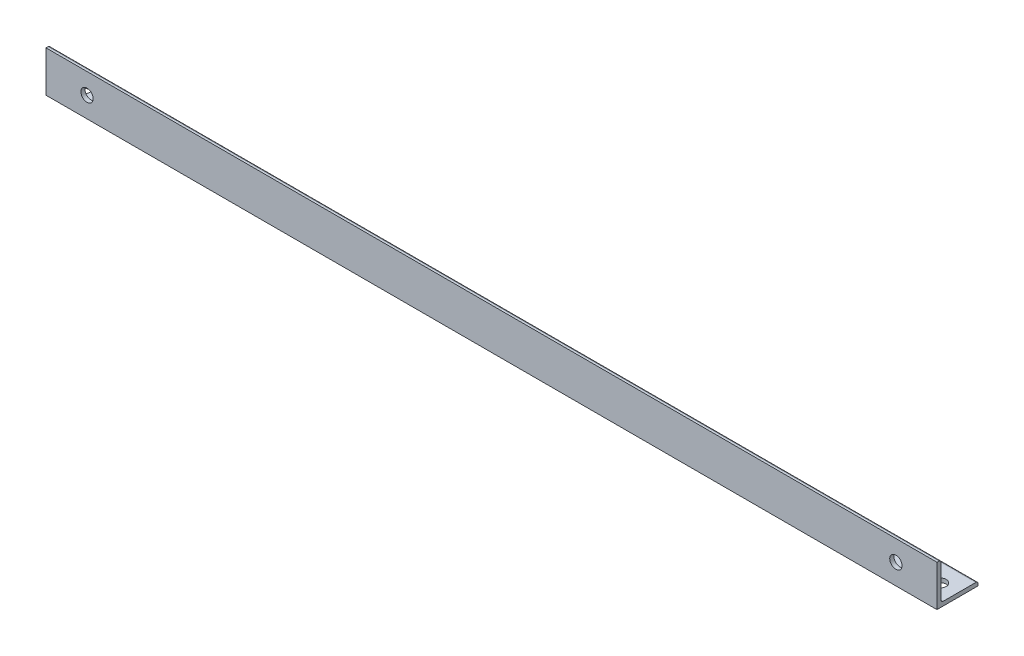
ISO-10303-21;
HEADER;
FILE_DESCRIPTION(('STEP AP214'),'2;1');
FILE_NAME('part.step','',(''),(''),'','','');
FILE_SCHEMA(('AUTOMOTIVE_DESIGN { 1 0 10303 214 1 1 1 1 }'));
ENDSEC;
DATA;
#1=APPLICATION_CONTEXT('core data for automotive mechanical design processes');
#2=APPLICATION_PROTOCOL_DEFINITION('international standard','automotive_design',2000,#1);
#3=PRODUCT_CONTEXT('',#1,'mechanical');
#4=PRODUCT('Part','Part','',(#3));
#5=PRODUCT_RELATED_PRODUCT_CATEGORY('part','',(#4));
#6=PRODUCT_DEFINITION_FORMATION('','',#4);
#7=PRODUCT_DEFINITION_CONTEXT('part definition',#1,'design');
#8=PRODUCT_DEFINITION('design','',#6,#7);
#9=PRODUCT_DEFINITION_SHAPE('','',#8);
#10=(LENGTH_UNIT() NAMED_UNIT(*) SI_UNIT(.MILLI.,.METRE.));
#11=(NAMED_UNIT(*) PLANE_ANGLE_UNIT() SI_UNIT($,.RADIAN.));
#12=(NAMED_UNIT(*) SI_UNIT($,.STERADIAN.) SOLID_ANGLE_UNIT());
#13=UNCERTAINTY_MEASURE_WITH_UNIT(LENGTH_MEASURE(1.E-05),#10,'distance_accuracy_value','');
#14=(GEOMETRIC_REPRESENTATION_CONTEXT(3) GLOBAL_UNCERTAINTY_ASSIGNED_CONTEXT((#13)) GLOBAL_UNIT_ASSIGNED_CONTEXT((#10,
#11,#12)) REPRESENTATION_CONTEXT('',''));
#15=CARTESIAN_POINT('',(0.,0.,0.));
#16=DIRECTION('',(0.,0.,1.));
#17=DIRECTION('',(1.,0.,0.));
#18=AXIS2_PLACEMENT_3D('',#15,#16,#17);
#19=CARTESIAN_POINT('',(434.,0.,0.));
#20=DIRECTION('',(0.,1.,0.));
#21=DIRECTION('',(0.,0.,1.));
#22=AXIS2_PLACEMENT_3D('',#19,#20,#21);
#23=PLANE('',#22);
#24=CARTESIAN_POINT('',(184.5,0.,-10.));
#25=DIRECTION('',(0.,1.,0.));
#26=DIRECTION('',(0.,0.,1.));
#27=AXIS2_PLACEMENT_3D('',#24,#25,#26);
#28=CIRCLE('',#27,2.99999999999999);
#29=CARTESIAN_POINT('',(184.5,0.,-7.00000000000001));
#30=VERTEX_POINT('',#29);
#31=EDGE_CURVE('E228',#30,#30,#28,.T.);
#32=ORIENTED_EDGE('',*,*,#31,.T.);
#33=EDGE_LOOP('',(#32));
#34=FACE_BOUND('',#33,.T.);
#35=CARTESIAN_POINT('',(8.5,0.,-10.));
#36=DIRECTION('',(0.,-1.,0.));
#37=DIRECTION('',(0.,0.,-1.));
#38=AXIS2_PLACEMENT_3D('',#35,#36,#37);
#39=CIRCLE('',#38,3.);
#40=CARTESIAN_POINT('',(8.5,0.,-13.));
#41=VERTEX_POINT('',#40);
#42=EDGE_CURVE('E177',#41,#41,#39,.T.);
#43=ORIENTED_EDGE('',*,*,#42,.F.);
#44=EDGE_LOOP('',(#43));
#45=FACE_BOUND('',#44,.T.);
#46=CARTESIAN_POINT('',(425.5,0.,-10.));
#47=DIRECTION('',(0.,-1.,0.));
#48=DIRECTION('',(0.,0.,-1.));
#49=AXIS2_PLACEMENT_3D('',#46,#47,#48);
#50=CIRCLE('',#49,2.99999999999999);
#51=CARTESIAN_POINT('',(425.5,0.,-13.));
#52=VERTEX_POINT('',#51);
#53=EDGE_CURVE('E169',#52,#52,#50,.T.);
#54=ORIENTED_EDGE('',*,*,#53,.F.);
#55=EDGE_LOOP('',(#54));
#56=FACE_BOUND('',#55,.T.);
#57=DIRECTION('',(0.,0.,-1.));
#58=VECTOR('',#57,1.);
#59=CARTESIAN_POINT('',(0.,0.,0.));
#60=LINE('',#59,#58);
#61=CARTESIAN_POINT('',(0.,0.,0.));
#62=VERTEX_POINT('',#61);
#63=CARTESIAN_POINT('',(0.,0.,-20.));
#64=VERTEX_POINT('',#63);
#65=EDGE_CURVE('E137',#62,#64,#60,.T.);
#66=ORIENTED_EDGE('',*,*,#65,.T.);
#67=DIRECTION('',(-1.,0.,0.));
#68=VECTOR('',#67,1.);
#69=CARTESIAN_POINT('',(434.,0.,-20.));
#70=LINE('',#69,#68);
#71=CARTESIAN_POINT('',(434.,0.,-20.));
#72=VERTEX_POINT('',#71);
#73=EDGE_CURVE('E11',#72,#64,#70,.T.);
#74=ORIENTED_EDGE('',*,*,#73,.F.);
#75=DIRECTION('',(0.,0.,-1.));
#76=VECTOR('',#75,1.);
#77=CARTESIAN_POINT('',(434.,0.,0.));
#78=LINE('',#77,#76);
#79=CARTESIAN_POINT('',(434.,0.,0.));
#80=VERTEX_POINT('',#79);
#81=EDGE_CURVE('E154',#80,#72,#78,.T.);
#82=ORIENTED_EDGE('',*,*,#81,.F.);
#83=DIRECTION('',(-1.,0.,0.));
#84=VECTOR('',#83,1.);
#85=CARTESIAN_POINT('',(434.,0.,0.));
#86=LINE('',#85,#84);
#87=EDGE_CURVE('E133',#80,#62,#86,.T.);
#88=ORIENTED_EDGE('',*,*,#87,.T.);
#89=EDGE_LOOP('',(#66,#74,#82,#88));
#90=FACE_BOUND('',#89,.T.);
#91=ADVANCED_FACE('F33',(#34,#45,#56,#90),#23,.F.);
#92=CARTESIAN_POINT('',(434.,1.,-20.));
#93=DIRECTION('',(0.,0.,1.));
#94=DIRECTION('',(1.,0.,0.));
#95=AXIS2_PLACEMENT_3D('',#92,#93,#94);
#96=PLANE('',#95);
#97=DIRECTION('',(0.,1.,0.));
#98=VECTOR('',#97,1.);
#99=CARTESIAN_POINT('',(0.,1.,-20.));
#100=LINE('',#99,#98);
#101=CARTESIAN_POINT('',(0.,1.,-20.));
#102=VERTEX_POINT('',#101);
#103=EDGE_CURVE('E140',#64,#102,#100,.T.);
#104=ORIENTED_EDGE('',*,*,#103,.T.);
#105=DIRECTION('',(-1.,0.,0.));
#106=VECTOR('',#105,1.);
#107=CARTESIAN_POINT('',(434.,1.,-20.));
#108=LINE('',#107,#106);
#109=CARTESIAN_POINT('',(434.,1.,-20.));
#110=VERTEX_POINT('',#109);
#111=EDGE_CURVE('E42',#110,#102,#108,.T.);
#112=ORIENTED_EDGE('',*,*,#111,.F.);
#113=DIRECTION('',(0.,1.,0.));
#114=VECTOR('',#113,1.);
#115=CARTESIAN_POINT('',(434.,1.,-20.));
#116=LINE('',#115,#114);
#117=EDGE_CURVE('E97',#72,#110,#116,.T.);
#118=ORIENTED_EDGE('',*,*,#117,.F.);
#119=ORIENTED_EDGE('',*,*,#73,.T.);
#120=EDGE_LOOP('',(#104,#112,#118,#119));
#121=FACE_BOUND('',#120,.T.);
#122=ADVANCED_FACE('F219',(#121),#96,.F.);
#123=CARTESIAN_POINT('',(434.,1.,-19.));
#124=DIRECTION('',(-1.,0.,0.));
#125=DIRECTION('',(0.,0.,1.));
#126=AXIS2_PLACEMENT_3D('',#123,#124,#125);
#127=CYLINDRICAL_SURFACE('',#126,1.);
#128=CARTESIAN_POINT('',(0.,1.,-19.));
#129=DIRECTION('',(1.,0.,0.));
#130=DIRECTION('',(0.,0.,1.));
#131=AXIS2_PLACEMENT_3D('',#128,#129,#130);
#132=CIRCLE('',#131,1.);
#133=CARTESIAN_POINT('',(0.,2.,-19.));
#134=VERTEX_POINT('',#133);
#135=EDGE_CURVE('E143',#102,#134,#132,.T.);
#136=ORIENTED_EDGE('',*,*,#135,.T.);
#137=DIRECTION('',(-1.,0.,0.));
#138=VECTOR('',#137,1.);
#139=CARTESIAN_POINT('',(434.,2.,-19.));
#140=LINE('',#139,#138);
#141=CARTESIAN_POINT('',(434.,2.,-19.));
#142=VERTEX_POINT('',#141);
#143=EDGE_CURVE('E164',#142,#134,#140,.T.);
#144=ORIENTED_EDGE('',*,*,#143,.F.);
#145=CARTESIAN_POINT('',(434.,1.,-19.));
#146=DIRECTION('',(1.,0.,0.));
#147=DIRECTION('',(0.,0.,1.));
#148=AXIS2_PLACEMENT_3D('',#145,#146,#147);
#149=CIRCLE('',#148,1.);
#150=EDGE_CURVE('E183',#110,#142,#149,.T.);
#151=ORIENTED_EDGE('',*,*,#150,.F.);
#152=ORIENTED_EDGE('',*,*,#111,.T.);
#153=EDGE_LOOP('',(#136,#144,#151,#152));
#154=FACE_BOUND('',#153,.T.);
#155=ADVANCED_FACE('F224',(#154),#127,.T.);
#156=CARTESIAN_POINT('',(434.,2.,-3.));
#157=DIRECTION('',(0.,-1.,0.));
#158=DIRECTION('',(0.,0.,-1.));
#159=AXIS2_PLACEMENT_3D('',#156,#157,#158);
#160=PLANE('',#159);
#161=CARTESIAN_POINT('',(184.5,2.,-10.));
#162=DIRECTION('',(0.,1.,0.));
#163=DIRECTION('',(0.,0.,1.));
#164=AXIS2_PLACEMENT_3D('',#161,#162,#163);
#165=CIRCLE('',#164,2.99999999999999);
#166=CARTESIAN_POINT('',(184.5,2.,-7.00000000000001));
#167=VERTEX_POINT('',#166);
#168=EDGE_CURVE('E245',#167,#167,#165,.T.);
#169=ORIENTED_EDGE('',*,*,#168,.F.);
#170=EDGE_LOOP('',(#169));
#171=FACE_BOUND('',#170,.T.);
#172=CARTESIAN_POINT('',(8.5,2.,-10.));
#173=DIRECTION('',(0.,-1.,0.));
#174=DIRECTION('',(0.,0.,-1.));
#175=AXIS2_PLACEMENT_3D('',#172,#173,#174);
#176=CIRCLE('',#175,3.);
#177=CARTESIAN_POINT('',(8.5,2.,-13.));
#178=VERTEX_POINT('',#177);
#179=EDGE_CURVE('E36',#178,#178,#176,.T.);
#180=ORIENTED_EDGE('',*,*,#179,.T.);
#181=EDGE_LOOP('',(#180));
#182=FACE_BOUND('',#181,.T.);
#183=CARTESIAN_POINT('',(425.5,2.,-10.));
#184=DIRECTION('',(0.,-1.,0.));
#185=DIRECTION('',(0.,0.,-1.));
#186=AXIS2_PLACEMENT_3D('',#183,#184,#185);
#187=CIRCLE('',#186,2.99999999999999);
#188=CARTESIAN_POINT('',(425.5,2.,-13.));
#189=VERTEX_POINT('',#188);
#190=EDGE_CURVE('E141',#189,#189,#187,.T.);
#191=ORIENTED_EDGE('',*,*,#190,.T.);
#192=EDGE_LOOP('',(#191));
#193=FACE_BOUND('',#192,.T.);
#194=DIRECTION('',(0.,0.,1.));
#195=VECTOR('',#194,1.);
#196=CARTESIAN_POINT('',(0.,2.,-3.));
#197=LINE('',#196,#195);
#198=CARTESIAN_POINT('',(0.,2.,-3.));
#199=VERTEX_POINT('',#198);
#200=EDGE_CURVE('E145',#134,#199,#197,.T.);
#201=ORIENTED_EDGE('',*,*,#200,.T.);
#202=DIRECTION('',(-1.,0.,0.));
#203=VECTOR('',#202,1.);
#204=CARTESIAN_POINT('',(434.,2.,-3.));
#205=LINE('',#204,#203);
#206=CARTESIAN_POINT('',(434.,2.,-3.));
#207=VERTEX_POINT('',#206);
#208=EDGE_CURVE('E161',#207,#199,#205,.T.);
#209=ORIENTED_EDGE('',*,*,#208,.F.);
#210=DIRECTION('',(0.,0.,1.));
#211=VECTOR('',#210,1.);
#212=CARTESIAN_POINT('',(434.,2.,-3.));
#213=LINE('',#212,#211);
#214=EDGE_CURVE('E185',#142,#207,#213,.T.);
#215=ORIENTED_EDGE('',*,*,#214,.F.);
#216=ORIENTED_EDGE('',*,*,#143,.T.);
#217=EDGE_LOOP('',(#201,#209,#215,#216));
#218=FACE_BOUND('',#217,.T.);
#219=ADVANCED_FACE('F252',(#171,#182,#193,#218),#160,.F.);
#220=CARTESIAN_POINT('',(434.,3.,-3.));
#221=DIRECTION('',(-1.,0.,0.));
#222=DIRECTION('',(0.,0.,1.));
#223=AXIS2_PLACEMENT_3D('',#220,#221,#222);
#224=CYLINDRICAL_SURFACE('',#223,1.);
#225=CARTESIAN_POINT('',(0.,3.,-3.));
#226=DIRECTION('',(-1.,0.,0.));
#227=DIRECTION('',(0.,0.,-1.));
#228=AXIS2_PLACEMENT_3D('',#225,#226,#227);
#229=CIRCLE('',#228,1.);
#230=CARTESIAN_POINT('',(0.,3.,-2.));
#231=VERTEX_POINT('',#230);
#232=EDGE_CURVE('E147',#199,#231,#229,.T.);
#233=ORIENTED_EDGE('',*,*,#232,.T.);
#234=DIRECTION('',(-1.,0.,0.));
#235=VECTOR('',#234,1.);
#236=CARTESIAN_POINT('',(434.,3.,-2.));
#237=LINE('',#236,#235);
#238=CARTESIAN_POINT('',(434.,3.,-2.));
#239=VERTEX_POINT('',#238);
#240=EDGE_CURVE('E158',#239,#231,#237,.T.);
#241=ORIENTED_EDGE('',*,*,#240,.F.);
#242=CARTESIAN_POINT('',(434.,3.,-3.));
#243=DIRECTION('',(-1.,0.,0.));
#244=DIRECTION('',(0.,0.,-1.));
#245=AXIS2_PLACEMENT_3D('',#242,#243,#244);
#246=CIRCLE('',#245,1.);
#247=EDGE_CURVE('E187',#207,#239,#246,.T.);
#248=ORIENTED_EDGE('',*,*,#247,.F.);
#249=ORIENTED_EDGE('',*,*,#208,.T.);
#250=EDGE_LOOP('',(#233,#241,#248,#249));
#251=FACE_BOUND('',#250,.T.);
#252=ADVANCED_FACE('F193',(#251),#224,.F.);
#253=CARTESIAN_POINT('',(434.,19.,-2.));
#254=DIRECTION('',(0.,0.,1.));
#255=DIRECTION('',(0.,-1.,0.));
#256=AXIS2_PLACEMENT_3D('',#253,#254,#255);
#257=PLANE('',#256);
#258=CARTESIAN_POINT('',(20.,10.,-2.));
#259=DIRECTION('',(0.,0.,-1.));
#260=DIRECTION('',(0.,1.,0.));
#261=AXIS2_PLACEMENT_3D('',#258,#259,#260);
#262=CIRCLE('',#261,2.99999999999999);
#263=CARTESIAN_POINT('',(20.,13.,-2.));
#264=VERTEX_POINT('',#263);
#265=EDGE_CURVE('E241',#264,#264,#262,.T.);
#266=ORIENTED_EDGE('',*,*,#265,.F.);
#267=EDGE_LOOP('',(#266));
#268=FACE_BOUND('',#267,.T.);
#269=CARTESIAN_POINT('',(414.,10.,-2.));
#270=DIRECTION('',(0.,0.,-1.));
#271=DIRECTION('',(0.,1.,0.));
#272=AXIS2_PLACEMENT_3D('',#269,#270,#271);
#273=CIRCLE('',#272,2.99999999999999);
#274=CARTESIAN_POINT('',(414.,13.,-2.));
#275=VERTEX_POINT('',#274);
#276=EDGE_CURVE('E235',#275,#275,#273,.T.);
#277=ORIENTED_EDGE('',*,*,#276,.F.);
#278=EDGE_LOOP('',(#277));
#279=FACE_BOUND('',#278,.T.);
#280=DIRECTION('',(0.,1.,0.));
#281=VECTOR('',#280,1.);
#282=CARTESIAN_POINT('',(0.,19.,-2.));
#283=LINE('',#282,#281);
#284=CARTESIAN_POINT('',(0.,19.,-2.));
#285=VERTEX_POINT('',#284);
#286=EDGE_CURVE('E149',#231,#285,#283,.T.);
#287=ORIENTED_EDGE('',*,*,#286,.T.);
#288=DIRECTION('',(-1.,0.,0.));
#289=VECTOR('',#288,1.);
#290=CARTESIAN_POINT('',(434.,19.,-2.));
#291=LINE('',#290,#289);
#292=CARTESIAN_POINT('',(434.,19.,-2.));
#293=VERTEX_POINT('',#292);
#294=EDGE_CURVE('E128',#293,#285,#291,.T.);
#295=ORIENTED_EDGE('',*,*,#294,.F.);
#296=DIRECTION('',(0.,1.,0.));
#297=VECTOR('',#296,1.);
#298=CARTESIAN_POINT('',(434.,19.,-2.));
#299=LINE('',#298,#297);
#300=EDGE_CURVE('E119',#239,#293,#299,.T.);
#301=ORIENTED_EDGE('',*,*,#300,.F.);
#302=ORIENTED_EDGE('',*,*,#240,.T.);
#303=EDGE_LOOP('',(#287,#295,#301,#302));
#304=FACE_BOUND('',#303,.T.);
#305=ADVANCED_FACE('F197',(#268,#279,#304),#257,.F.);
#306=CARTESIAN_POINT('',(434.,19.,-1.));
#307=DIRECTION('',(-1.,0.,0.));
#308=DIRECTION('',(0.,0.,1.));
#309=AXIS2_PLACEMENT_3D('',#306,#307,#308);
#310=CYLINDRICAL_SURFACE('',#309,1.);
#311=CARTESIAN_POINT('',(0.,19.,-1.));
#312=DIRECTION('',(1.,0.,0.));
#313=DIRECTION('',(0.,0.,1.));
#314=AXIS2_PLACEMENT_3D('',#311,#312,#313);
#315=CIRCLE('',#314,1.);
#316=CARTESIAN_POINT('',(0.,20.,-1.));
#317=VERTEX_POINT('',#316);
#318=EDGE_CURVE('E127',#285,#317,#315,.T.);
#319=ORIENTED_EDGE('',*,*,#318,.T.);
#320=DIRECTION('',(-1.,0.,0.));
#321=VECTOR('',#320,1.);
#322=CARTESIAN_POINT('',(434.,20.,-1.));
#323=LINE('',#322,#321);
#324=CARTESIAN_POINT('',(434.,20.,-1.));
#325=VERTEX_POINT('',#324);
#326=EDGE_CURVE('E124',#325,#317,#323,.T.);
#327=ORIENTED_EDGE('',*,*,#326,.F.);
#328=CARTESIAN_POINT('',(434.,19.,-1.));
#329=DIRECTION('',(1.,0.,0.));
#330=DIRECTION('',(0.,0.,1.));
#331=AXIS2_PLACEMENT_3D('',#328,#329,#330);
#332=CIRCLE('',#331,1.);
#333=EDGE_CURVE('E113',#293,#325,#332,.T.);
#334=ORIENTED_EDGE('',*,*,#333,.F.);
#335=ORIENTED_EDGE('',*,*,#294,.T.);
#336=EDGE_LOOP('',(#319,#327,#334,#335));
#337=FACE_BOUND('',#336,.T.);
#338=ADVANCED_FACE('F125',(#337),#310,.T.);
#339=CARTESIAN_POINT('',(434.,20.,0.));
#340=DIRECTION('',(0.,-1.,0.));
#341=DIRECTION('',(0.,0.,-1.));
#342=AXIS2_PLACEMENT_3D('',#339,#340,#341);
#343=PLANE('',#342);
#344=DIRECTION('',(0.,0.,1.));
#345=VECTOR('',#344,1.);
#346=CARTESIAN_POINT('',(0.,20.,0.));
#347=LINE('',#346,#345);
#348=CARTESIAN_POINT('',(0.,20.,0.));
#349=VERTEX_POINT('',#348);
#350=EDGE_CURVE('E83',#317,#349,#347,.T.);
#351=ORIENTED_EDGE('',*,*,#350,.T.);
#352=DIRECTION('',(-1.,0.,0.));
#353=VECTOR('',#352,1.);
#354=CARTESIAN_POINT('',(434.,20.,0.));
#355=LINE('',#354,#353);
#356=CARTESIAN_POINT('',(434.,20.,0.));
#357=VERTEX_POINT('',#356);
#358=EDGE_CURVE('E129',#357,#349,#355,.T.);
#359=ORIENTED_EDGE('',*,*,#358,.F.);
#360=DIRECTION('',(0.,0.,1.));
#361=VECTOR('',#360,1.);
#362=CARTESIAN_POINT('',(434.,20.,0.));
#363=LINE('',#362,#361);
#364=EDGE_CURVE('E117',#325,#357,#363,.T.);
#365=ORIENTED_EDGE('',*,*,#364,.F.);
#366=ORIENTED_EDGE('',*,*,#326,.T.);
#367=EDGE_LOOP('',(#351,#359,#365,#366));
#368=FACE_BOUND('',#367,.T.);
#369=ADVANCED_FACE('F131',(#368),#343,.F.);
#370=CARTESIAN_POINT('',(434.,0.,0.));
#371=DIRECTION('',(0.,0.,-1.));
#372=DIRECTION('',(-1.,0.,0.));
#373=AXIS2_PLACEMENT_3D('',#370,#371,#372);
#374=PLANE('',#373);
#375=CARTESIAN_POINT('',(20.,10.,0.));
#376=DIRECTION('',(0.,0.,-1.));
#377=DIRECTION('',(0.,1.,0.));
#378=AXIS2_PLACEMENT_3D('',#375,#376,#377);
#379=CIRCLE('',#378,2.99999999999999);
#380=CARTESIAN_POINT('',(20.,13.,0.));
#381=VERTEX_POINT('',#380);
#382=EDGE_CURVE('E239',#381,#381,#379,.T.);
#383=ORIENTED_EDGE('',*,*,#382,.T.);
#384=EDGE_LOOP('',(#383));
#385=FACE_BOUND('',#384,.T.);
#386=CARTESIAN_POINT('',(414.,10.,0.));
#387=DIRECTION('',(0.,0.,-1.));
#388=DIRECTION('',(0.,1.,0.));
#389=AXIS2_PLACEMENT_3D('',#386,#387,#388);
#390=CIRCLE('',#389,2.99999999999999);
#391=CARTESIAN_POINT('',(414.,13.,0.));
#392=VERTEX_POINT('',#391);
#393=EDGE_CURVE('E233',#392,#392,#390,.T.);
#394=ORIENTED_EDGE('',*,*,#393,.T.);
#395=EDGE_LOOP('',(#394));
#396=FACE_BOUND('',#395,.T.);
#397=DIRECTION('',(0.,-1.,0.));
#398=VECTOR('',#397,1.);
#399=CARTESIAN_POINT('',(0.,0.,0.));
#400=LINE('',#399,#398);
#401=EDGE_CURVE('E89',#349,#62,#400,.T.);
#402=ORIENTED_EDGE('',*,*,#401,.T.);
#403=ORIENTED_EDGE('',*,*,#87,.F.);
#404=DIRECTION('',(0.,-1.,0.));
#405=VECTOR('',#404,1.);
#406=CARTESIAN_POINT('',(434.,0.,0.));
#407=LINE('',#406,#405);
#408=EDGE_CURVE('E51',#357,#80,#407,.T.);
#409=ORIENTED_EDGE('',*,*,#408,.F.);
#410=ORIENTED_EDGE('',*,*,#358,.T.);
#411=EDGE_LOOP('',(#402,#403,#409,#410));
#412=FACE_BOUND('',#411,.T.);
#413=ADVANCED_FACE('F205',(#385,#396,#412),#374,.F.);
#414=CARTESIAN_POINT('',(434.,1.,-19.));
#415=DIRECTION('',(-1.,0.,0.));
#416=DIRECTION('',(0.,0.,1.));
#417=AXIS2_PLACEMENT_3D('',#414,#415,#416);
#418=PLANE('',#417);
#419=ORIENTED_EDGE('',*,*,#81,.T.);
#420=ORIENTED_EDGE('',*,*,#117,.T.);
#421=ORIENTED_EDGE('',*,*,#150,.T.);
#422=ORIENTED_EDGE('',*,*,#214,.T.);
#423=ORIENTED_EDGE('',*,*,#247,.T.);
#424=ORIENTED_EDGE('',*,*,#300,.T.);
#425=ORIENTED_EDGE('',*,*,#333,.T.);
#426=ORIENTED_EDGE('',*,*,#364,.T.);
#427=ORIENTED_EDGE('',*,*,#408,.T.);
#428=EDGE_LOOP('',(#419,#420,#421,#422,#423,#424,#425,#426,#427));
#429=FACE_BOUND('',#428,.T.);
#430=ADVANCED_FACE('F115',(#429),#418,.F.);
#431=CARTESIAN_POINT('',(0.,1.,-19.));
#432=DIRECTION('',(-1.,0.,0.));
#433=DIRECTION('',(0.,0.,1.));
#434=AXIS2_PLACEMENT_3D('',#431,#432,#433);
#435=PLANE('',#434);
#436=ORIENTED_EDGE('',*,*,#65,.F.);
#437=ORIENTED_EDGE('',*,*,#401,.F.);
#438=ORIENTED_EDGE('',*,*,#350,.F.);
#439=ORIENTED_EDGE('',*,*,#318,.F.);
#440=ORIENTED_EDGE('',*,*,#286,.F.);
#441=ORIENTED_EDGE('',*,*,#232,.F.);
#442=ORIENTED_EDGE('',*,*,#200,.F.);
#443=ORIENTED_EDGE('',*,*,#135,.F.);
#444=ORIENTED_EDGE('',*,*,#103,.F.);
#445=EDGE_LOOP('',(#436,#437,#438,#439,#440,#441,#442,#443,#444));
#446=FACE_BOUND('',#445,.T.);
#447=ADVANCED_FACE('F200',(#446),#435,.T.);
#448=CARTESIAN_POINT('',(425.5,20.,-10.));
#449=DIRECTION('',(0.,-1.,0.));
#450=DIRECTION('',(0.,0.,-1.));
#451=AXIS2_PLACEMENT_3D('',#448,#449,#450);
#452=CYLINDRICAL_SURFACE('',#451,2.99999999999999);
#453=ORIENTED_EDGE('',*,*,#53,.T.);
#454=EDGE_LOOP('',(#453));
#455=FACE_BOUND('',#454,.T.);
#456=ORIENTED_EDGE('',*,*,#190,.F.);
#457=EDGE_LOOP('',(#456));
#458=FACE_BOUND('',#457,.T.);
#459=ADVANCED_FACE('F298',(#455,#458),#452,.F.);
#460=CARTESIAN_POINT('',(8.5,20.,-10.));
#461=DIRECTION('',(0.,-1.,0.));
#462=DIRECTION('',(0.,0.,-1.));
#463=AXIS2_PLACEMENT_3D('',#460,#461,#462);
#464=CYLINDRICAL_SURFACE('',#463,3.);
#465=ORIENTED_EDGE('',*,*,#42,.T.);
#466=EDGE_LOOP('',(#465));
#467=FACE_BOUND('',#466,.T.);
#468=ORIENTED_EDGE('',*,*,#179,.F.);
#469=EDGE_LOOP('',(#468));
#470=FACE_BOUND('',#469,.T.);
#471=ADVANCED_FACE('F306',(#467,#470),#464,.F.);
#472=CARTESIAN_POINT('',(414.,10.,0.));
#473=DIRECTION('',(0.,0.,-1.));
#474=DIRECTION('',(0.,1.,0.));
#475=AXIS2_PLACEMENT_3D('',#472,#473,#474);
#476=CYLINDRICAL_SURFACE('',#475,2.99999999999999);
#477=ORIENTED_EDGE('',*,*,#393,.F.);
#478=EDGE_LOOP('',(#477));
#479=FACE_BOUND('',#478,.T.);
#480=ORIENTED_EDGE('',*,*,#276,.T.);
#481=EDGE_LOOP('',(#480));
#482=FACE_BOUND('',#481,.T.);
#483=ADVANCED_FACE('F314',(#479,#482),#476,.F.);
#484=CARTESIAN_POINT('',(20.,10.,0.));
#485=DIRECTION('',(0.,0.,-1.));
#486=DIRECTION('',(0.,1.,0.));
#487=AXIS2_PLACEMENT_3D('',#484,#485,#486);
#488=CYLINDRICAL_SURFACE('',#487,2.99999999999999);
#489=ORIENTED_EDGE('',*,*,#382,.F.);
#490=EDGE_LOOP('',(#489));
#491=FACE_BOUND('',#490,.T.);
#492=ORIENTED_EDGE('',*,*,#265,.T.);
#493=EDGE_LOOP('',(#492));
#494=FACE_BOUND('',#493,.T.);
#495=ADVANCED_FACE('F332',(#491,#494),#488,.F.);
#496=CARTESIAN_POINT('',(184.5,0.,-10.));
#497=DIRECTION('',(0.,1.,0.));
#498=DIRECTION('',(0.,0.,1.));
#499=AXIS2_PLACEMENT_3D('',#496,#497,#498);
#500=CYLINDRICAL_SURFACE('',#499,2.99999999999999);
#501=ORIENTED_EDGE('',*,*,#31,.F.);
#502=EDGE_LOOP('',(#501));
#503=FACE_BOUND('',#502,.T.);
#504=ORIENTED_EDGE('',*,*,#168,.T.);
#505=EDGE_LOOP('',(#504));
#506=FACE_BOUND('',#505,.T.);
#507=ADVANCED_FACE('F250',(#503,#506),#500,.F.);
#508=CLOSED_SHELL('',(#91,#122,#155,#219,#252,#305,#338,#369,#413,#430,#447,#459,#471,#483,#495,#507));
#509=MANIFOLD_SOLID_BREP('B2',#508);
#510=ADVANCED_BREP_SHAPE_REPRESENTATION('',(#18,#509),#14);
#511=SHAPE_DEFINITION_REPRESENTATION(#9,#510);
ENDSEC;
END-ISO-10303-21;
